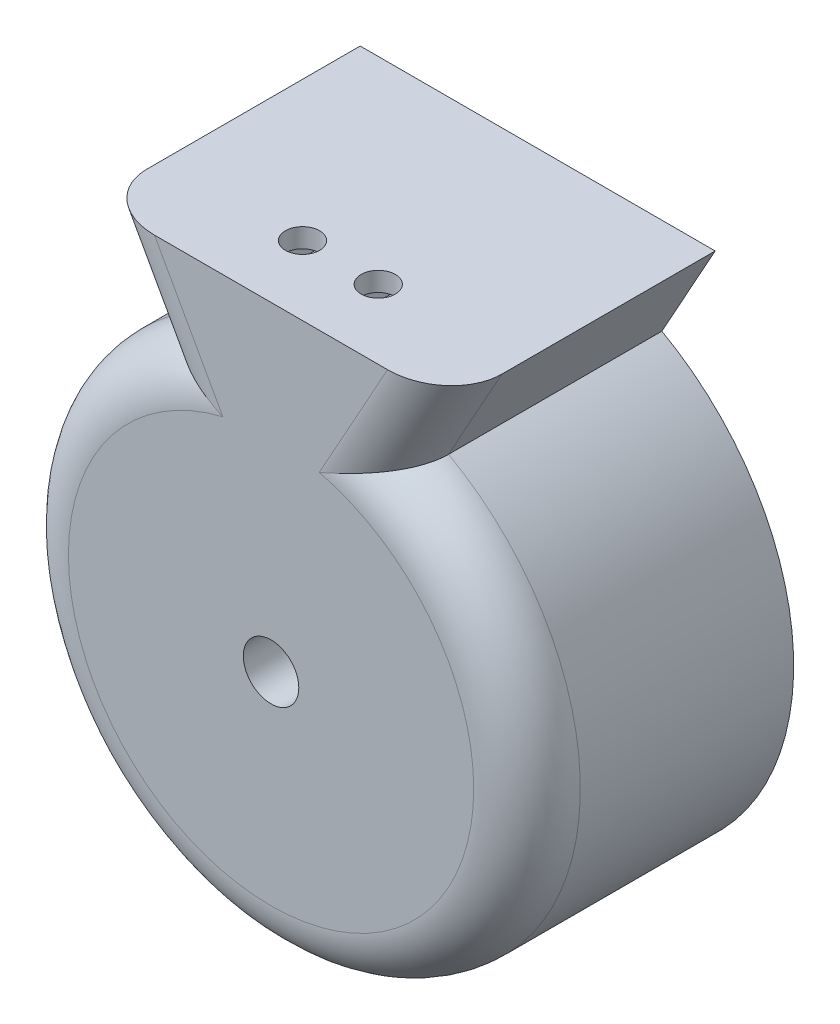
ISO-10303-21;
HEADER;
FILE_DESCRIPTION(('STEP AP214'),'2;1');
FILE_NAME('part.step','',(''),(''),'','','');
FILE_SCHEMA(('AUTOMOTIVE_DESIGN { 1 0 10303 214 1 1 1 1 }'));
ENDSEC;
DATA;
#1=APPLICATION_CONTEXT('core data for automotive mechanical design processes');
#2=APPLICATION_PROTOCOL_DEFINITION('international standard','automotive_design',2000,#1);
#3=PRODUCT_CONTEXT('',#1,'mechanical');
#4=PRODUCT('Part','Part','',(#3));
#5=PRODUCT_RELATED_PRODUCT_CATEGORY('part','',(#4));
#6=PRODUCT_DEFINITION_FORMATION('','',#4);
#7=PRODUCT_DEFINITION_CONTEXT('part definition',#1,'design');
#8=PRODUCT_DEFINITION('design','',#6,#7);
#9=PRODUCT_DEFINITION_SHAPE('','',#8);
#10=(LENGTH_UNIT() NAMED_UNIT(*) SI_UNIT(.MILLI.,.METRE.));
#11=(NAMED_UNIT(*) PLANE_ANGLE_UNIT() SI_UNIT($,.RADIAN.));
#12=(NAMED_UNIT(*) SI_UNIT($,.STERADIAN.) SOLID_ANGLE_UNIT());
#13=UNCERTAINTY_MEASURE_WITH_UNIT(LENGTH_MEASURE(1.E-05),#10,'distance_accuracy_value','');
#14=(GEOMETRIC_REPRESENTATION_CONTEXT(3) GLOBAL_UNCERTAINTY_ASSIGNED_CONTEXT((#13)) GLOBAL_UNIT_ASSIGNED_CONTEXT((#10,
#11,#12)) REPRESENTATION_CONTEXT('',''));
#15=CARTESIAN_POINT('',(0.,0.,0.));
#16=DIRECTION('',(0.,0.,1.));
#17=DIRECTION('',(1.,0.,0.));
#18=AXIS2_PLACEMENT_3D('',#15,#16,#17);
#19=CARTESIAN_POINT('',(0.,0.,0.));
#20=DIRECTION('',(0.,0.,1.));
#21=DIRECTION('',(1.,0.,0.));
#22=AXIS2_PLACEMENT_3D('',#19,#20,#21);
#23=PLANE('',#22);
#24=DIRECTION('',(0.,-1.,0.));
#25=VECTOR('',#24,1.);
#26=CARTESIAN_POINT('',(-6.35,25.8,0.));
#27=LINE('',#26,#25);
#28=CARTESIAN_POINT('',(-6.35,28.2,0.));
#29=VERTEX_POINT('',#28);
#30=CARTESIAN_POINT('',(-6.35,25.8,0.));
#31=VERTEX_POINT('',#30);
#32=EDGE_CURVE('E65',#29,#31,#27,.T.);
#33=ORIENTED_EDGE('',*,*,#32,.T.);
#34=DIRECTION('',(1.,0.,0.));
#35=VECTOR('',#34,1.);
#36=CARTESIAN_POINT('',(-0.749999999999996,25.8,0.));
#37=LINE('',#36,#35);
#38=CARTESIAN_POINT('',(-0.749999999999996,25.8,0.));
#39=VERTEX_POINT('',#38);
#40=EDGE_CURVE('E196',#31,#39,#37,.T.);
#41=ORIENTED_EDGE('',*,*,#40,.T.);
#42=DIRECTION('',(0.,1.,0.));
#43=VECTOR('',#42,1.);
#44=CARTESIAN_POINT('',(-0.749999999999996,25.8,0.));
#45=LINE('',#44,#43);
#46=CARTESIAN_POINT('',(-0.749999999999996,28.2,0.));
#47=VERTEX_POINT('',#46);
#48=EDGE_CURVE('E200',#39,#47,#45,.T.);
#49=ORIENTED_EDGE('',*,*,#48,.T.);
#50=DIRECTION('',(-1.,0.,0.));
#51=VECTOR('',#50,1.);
#52=CARTESIAN_POINT('',(-0.749999999999996,28.2,0.));
#53=LINE('',#52,#51);
#54=EDGE_CURVE('E184',#47,#29,#53,.T.);
#55=ORIENTED_EDGE('',*,*,#54,.T.);
#56=EDGE_LOOP('',(#33,#41,#49,#55));
#57=FACE_BOUND('',#56,.T.);
#58=CARTESIAN_POINT('',(0.,0.,0.));
#59=DIRECTION('',(0.,0.,1.));
#60=DIRECTION('',(1.,0.,0.));
#61=AXIS2_PLACEMENT_3D('',#58,#59,#60);
#62=CIRCLE('',#61,20.);
#63=CARTESIAN_POINT('',(-20.,0.,0.));
#64=VERTEX_POINT('',#63);
#65=EDGE_CURVE('E239',#64,#64,#62,.T.);
#66=ORIENTED_EDGE('',*,*,#65,.T.);
#67=EDGE_LOOP('',(#66));
#68=FACE_BOUND('',#67,.T.);
#69=DIRECTION('',(0.485104998656678,-0.874455910997407,0.));
#70=VECTOR('',#69,1.);
#71=CARTESIAN_POINT('',(-16.6425199677603,30.,0.));
#72=LINE('',#71,#70);
#73=CARTESIAN_POINT('',(-16.6425199677603,30.,0.));
#74=VERTEX_POINT('',#73);
#75=CARTESIAN_POINT('',(-11.6425199677603,20.9869418639378,0.));
#76=VERTEX_POINT('',#75);
#77=EDGE_CURVE('E265',#74,#76,#72,.T.);
#78=ORIENTED_EDGE('',*,*,#77,.F.);
#79=DIRECTION('',(-1.,0.,0.));
#80=VECTOR('',#79,1.);
#81=CARTESIAN_POINT('',(-16.6425199677603,30.,0.));
#82=LINE('',#81,#80);
#83=CARTESIAN_POINT('',(16.6425199677603,30.,0.));
#84=VERTEX_POINT('',#83);
#85=EDGE_CURVE('E264',#84,#74,#82,.T.);
#86=ORIENTED_EDGE('',*,*,#85,.F.);
#87=DIRECTION('',(0.485104998656678,0.874455910997407,0.));
#88=VECTOR('',#87,1.);
#89=CARTESIAN_POINT('',(16.6425199677603,30.,0.));
#90=LINE('',#89,#88);
#91=CARTESIAN_POINT('',(11.6425199677603,20.9869418639378,0.));
#92=VERTEX_POINT('',#91);
#93=EDGE_CURVE('E274',#92,#84,#90,.T.);
#94=ORIENTED_EDGE('',*,*,#93,.F.);
#95=CARTESIAN_POINT('',(0.,0.,0.));
#96=DIRECTION('',(0.,0.,1.));
#97=DIRECTION('',(1.,0.,0.));
#98=AXIS2_PLACEMENT_3D('',#95,#96,#97);
#99=CIRCLE('',#98,24.);
#100=EDGE_CURVE('E269',#76,#92,#99,.T.);
#101=ORIENTED_EDGE('',*,*,#100,.F.);
#102=EDGE_LOOP('',(#78,#86,#94,#101));
#103=FACE_BOUND('',#102,.T.);
#104=DIRECTION('',(0.,-1.,0.));
#105=VECTOR('',#104,1.);
#106=CARTESIAN_POINT('',(0.750000000000003,25.8,0.));
#107=LINE('',#106,#105);
#108=CARTESIAN_POINT('',(0.750000000000003,28.2,0.));
#109=VERTEX_POINT('',#108);
#110=CARTESIAN_POINT('',(0.750000000000003,25.8,0.));
#111=VERTEX_POINT('',#110);
#112=EDGE_CURVE('E57',#109,#111,#107,.T.);
#113=ORIENTED_EDGE('',*,*,#112,.T.);
#114=DIRECTION('',(1.,0.,0.));
#115=VECTOR('',#114,1.);
#116=CARTESIAN_POINT('',(6.35,25.8,0.));
#117=LINE('',#116,#115);
#118=CARTESIAN_POINT('',(6.35,25.8,0.));
#119=VERTEX_POINT('',#118);
#120=EDGE_CURVE('E165',#111,#119,#117,.T.);
#121=ORIENTED_EDGE('',*,*,#120,.T.);
#122=DIRECTION('',(0.,1.,0.));
#123=VECTOR('',#122,1.);
#124=CARTESIAN_POINT('',(6.35,25.8,0.));
#125=LINE('',#124,#123);
#126=CARTESIAN_POINT('',(6.35,28.2,0.));
#127=VERTEX_POINT('',#126);
#128=EDGE_CURVE('E624',#119,#127,#125,.T.);
#129=ORIENTED_EDGE('',*,*,#128,.T.);
#130=DIRECTION('',(-1.,0.,0.));
#131=VECTOR('',#130,1.);
#132=CARTESIAN_POINT('',(6.35,28.2,0.));
#133=LINE('',#132,#131);
#134=EDGE_CURVE('E161',#127,#109,#133,.T.);
#135=ORIENTED_EDGE('',*,*,#134,.T.);
#136=EDGE_LOOP('',(#113,#121,#129,#135));
#137=FACE_BOUND('',#136,.T.);
#138=ADVANCED_FACE('F38',(#57,#68,#103,#137),#23,.F.);
#139=CARTESIAN_POINT('',(3.55,24.,18.5));
#140=DIRECTION('',(0.,1.,0.));
#141=DIRECTION('',(0.,0.,1.));
#142=AXIS2_PLACEMENT_3D('',#139,#140,#141);
#143=CYLINDRICAL_SURFACE('',#142,1.6);
#144=CARTESIAN_POINT('',(3.55,30.,18.5));
#145=DIRECTION('',(0.,-1.,0.));
#146=DIRECTION('',(0.,0.,-1.));
#147=AXIS2_PLACEMENT_3D('',#144,#145,#146);
#148=CIRCLE('',#147,1.6);
#149=CARTESIAN_POINT('',(3.55,30.,16.9));
#150=VERTEX_POINT('',#149);
#151=EDGE_CURVE('E231',#150,#150,#148,.T.);
#152=ORIENTED_EDGE('',*,*,#151,.F.);
#153=EDGE_LOOP('',(#152));
#154=FACE_BOUND('',#153,.T.);
#155=CARTESIAN_POINT('',(3.55,28.2,18.5));
#156=DIRECTION('',(0.,-1.,0.));
#157=DIRECTION('',(0.,0.,-1.));
#158=AXIS2_PLACEMENT_3D('',#155,#156,#157);
#159=CIRCLE('',#158,1.6);
#160=CARTESIAN_POINT('',(3.55,28.2,16.9));
#161=VERTEX_POINT('',#160);
#162=EDGE_CURVE('E608',#161,#161,#159,.T.);
#163=ORIENTED_EDGE('',*,*,#162,.T.);
#164=EDGE_LOOP('',(#163));
#165=FACE_BOUND('',#164,.T.);
#166=ADVANCED_FACE('F343',(#154,#165),#143,.F.);
#167=CARTESIAN_POINT('',(-3.55,24.,18.5));
#168=DIRECTION('',(0.,1.,0.));
#169=DIRECTION('',(0.,0.,1.));
#170=AXIS2_PLACEMENT_3D('',#167,#168,#169);
#171=CYLINDRICAL_SURFACE('',#170,1.6);
#172=CARTESIAN_POINT('',(-3.55,30.,18.5));
#173=DIRECTION('',(0.,-1.,0.));
#174=DIRECTION('',(0.,0.,-1.));
#175=AXIS2_PLACEMENT_3D('',#172,#173,#174);
#176=CIRCLE('',#175,1.6);
#177=CARTESIAN_POINT('',(-3.55,30.,16.9));
#178=VERTEX_POINT('',#177);
#179=EDGE_CURVE('E223',#178,#178,#176,.T.);
#180=ORIENTED_EDGE('',*,*,#179,.F.);
#181=EDGE_LOOP('',(#180));
#182=FACE_BOUND('',#181,.T.);
#183=CARTESIAN_POINT('',(-3.55,28.2,18.5));
#184=DIRECTION('',(0.,-1.,0.));
#185=DIRECTION('',(0.,0.,-1.));
#186=AXIS2_PLACEMENT_3D('',#183,#184,#185);
#187=CIRCLE('',#186,1.6);
#188=CARTESIAN_POINT('',(-3.55,28.2,16.9));
#189=VERTEX_POINT('',#188);
#190=EDGE_CURVE('E167',#189,#189,#187,.T.);
#191=ORIENTED_EDGE('',*,*,#190,.T.);
#192=EDGE_LOOP('',(#191));
#193=FACE_BOUND('',#192,.T.);
#194=ADVANCED_FACE('F352',(#182,#193),#171,.F.);
#195=CARTESIAN_POINT('',(0.,0.,0.));
#196=DIRECTION('',(0.,0.,1.));
#197=DIRECTION('',(1.,0.,0.));
#198=AXIS2_PLACEMENT_3D('',#195,#196,#197);
#199=CIRCLE('',#198,2.6);
#200=CARTESIAN_POINT('',(2.6,0.,0.));
#201=VERTEX_POINT('',#200);
#202=EDGE_CURVE('E247',#201,#201,#199,.T.);
#203=ORIENTED_EDGE('',*,*,#202,.T.);
#204=EDGE_LOOP('',(#203));
#205=FACE_BOUND('',#204,.T.);
#206=CARTESIAN_POINT('',(0.,0.,0.));
#207=DIRECTION('',(0.,0.,1.));
#208=DIRECTION('',(1.,0.,0.));
#209=AXIS2_PLACEMENT_3D('',#206,#207,#208);
#210=CIRCLE('',#209,7.5);
#211=CARTESIAN_POINT('',(-7.5,0.,0.));
#212=VERTEX_POINT('',#211);
#213=EDGE_CURVE('E222',#212,#212,#210,.T.);
#214=ORIENTED_EDGE('',*,*,#213,.F.);
#215=EDGE_LOOP('',(#214));
#216=FACE_BOUND('',#215,.T.);
#217=ADVANCED_FACE('F346',(#205,#216),#23,.F.);
#218=CARTESIAN_POINT('',(-16.6425199677603,30.,25.));
#219=DIRECTION('',(0.874455910997407,0.485104998656678,0.));
#220=DIRECTION('',(-0.485104998656678,0.874455910997407,0.));
#221=AXIS2_PLACEMENT_3D('',#218,#219,#220);
#222=PLANE('',#221);
#223=DIRECTION('',(0.,0.,-1.));
#224=VECTOR('',#223,1.);
#225=CARTESIAN_POINT('',(-11.6425199677603,20.9869418639378,25.));
#226=LINE('',#225,#224);
#227=CARTESIAN_POINT('',(-11.6425199677603,20.9869418639378,20.));
#228=VERTEX_POINT('',#227);
#229=EDGE_CURVE('E289',#228,#76,#226,.T.);
#230=ORIENTED_EDGE('',*,*,#229,.F.);
#231=DIRECTION('',(0.485104998656678,-0.874455910997407,0.));
#232=VECTOR('',#231,1.);
#233=CARTESIAN_POINT('',(-16.6425199677603,30.,20.));
#234=LINE('',#233,#232);
#235=CARTESIAN_POINT('',(-16.6425199677603,30.,20.));
#236=VERTEX_POINT('',#235);
#237=EDGE_CURVE('E305',#228,#236,#234,.F.);
#238=ORIENTED_EDGE('',*,*,#237,.T.);
#239=DIRECTION('',(0.,0.,-1.));
#240=VECTOR('',#239,1.);
#241=CARTESIAN_POINT('',(-16.6425199677603,30.,25.));
#242=LINE('',#241,#240);
#243=EDGE_CURVE('E263',#236,#74,#242,.T.);
#244=ORIENTED_EDGE('',*,*,#243,.T.);
#245=ORIENTED_EDGE('',*,*,#77,.T.);
#246=EDGE_LOOP('',(#230,#238,#244,#245));
#247=FACE_BOUND('',#246,.T.);
#248=ADVANCED_FACE('F360',(#247),#222,.F.);
#249=CARTESIAN_POINT('',(0.,0.,25.));
#250=DIRECTION('',(0.,0.,-1.));
#251=DIRECTION('',(-1.,0.,0.));
#252=AXIS2_PLACEMENT_3D('',#249,#250,#251);
#253=CYLINDRICAL_SURFACE('',#252,24.);
#254=DIRECTION('',(0.,0.,-1.));
#255=VECTOR('',#254,1.);
#256=CARTESIAN_POINT('',(11.6425199677603,20.9869418639378,25.));
#257=LINE('',#256,#255);
#258=CARTESIAN_POINT('',(11.6425199677603,20.9869418639378,20.));
#259=VERTEX_POINT('',#258);
#260=EDGE_CURVE('E286',#259,#92,#257,.T.);
#261=ORIENTED_EDGE('',*,*,#260,.F.);
#262=CARTESIAN_POINT('',(0.,0.,20.));
#263=DIRECTION('',(0.,0.,1.));
#264=DIRECTION('',(1.,0.,0.));
#265=AXIS2_PLACEMENT_3D('',#262,#263,#264);
#266=CIRCLE('',#265,24.);
#267=EDGE_CURVE('E302',#259,#228,#266,.F.);
#268=ORIENTED_EDGE('',*,*,#267,.T.);
#269=ORIENTED_EDGE('',*,*,#229,.T.);
#270=ORIENTED_EDGE('',*,*,#100,.T.);
#271=EDGE_LOOP('',(#261,#268,#269,#270));
#272=FACE_BOUND('',#271,.T.);
#273=ADVANCED_FACE('F365',(#272),#253,.T.);
#274=CARTESIAN_POINT('',(16.6425199677603,30.,25.));
#275=DIRECTION('',(-0.874455910997407,0.485104998656678,0.));
#276=DIRECTION('',(-0.485104998656678,-0.874455910997407,0.));
#277=AXIS2_PLACEMENT_3D('',#274,#275,#276);
#278=PLANE('',#277);
#279=DIRECTION('',(0.,0.,-1.));
#280=VECTOR('',#279,1.);
#281=CARTESIAN_POINT('',(16.6425199677603,30.,25.));
#282=LINE('',#281,#280);
#283=CARTESIAN_POINT('',(16.6425199677603,30.,20.));
#284=VERTEX_POINT('',#283);
#285=EDGE_CURVE('E283',#284,#84,#282,.T.);
#286=ORIENTED_EDGE('',*,*,#285,.F.);
#287=DIRECTION('',(0.485104998656678,0.874455910997407,0.));
#288=VECTOR('',#287,1.);
#289=CARTESIAN_POINT('',(11.6425199677603,20.9869418639378,20.));
#290=LINE('',#289,#288);
#291=EDGE_CURVE('E11',#284,#259,#290,.F.);
#292=ORIENTED_EDGE('',*,*,#291,.T.);
#293=ORIENTED_EDGE('',*,*,#260,.T.);
#294=ORIENTED_EDGE('',*,*,#93,.T.);
#295=EDGE_LOOP('',(#286,#292,#293,#294));
#296=FACE_BOUND('',#295,.T.);
#297=ADVANCED_FACE('F404',(#296),#278,.F.);
#298=CARTESIAN_POINT('',(-16.6425199677603,30.,25.));
#299=DIRECTION('',(0.,-1.,0.));
#300=DIRECTION('',(0.,0.,-1.));
#301=AXIS2_PLACEMENT_3D('',#298,#299,#300);
#302=PLANE('',#301);
#303=ORIENTED_EDGE('',*,*,#179,.T.);
#304=EDGE_LOOP('',(#303));
#305=FACE_BOUND('',#304,.T.);
#306=ORIENTED_EDGE('',*,*,#151,.T.);
#307=EDGE_LOOP('',(#306));
#308=FACE_BOUND('',#307,.T.);
#309=ORIENTED_EDGE('',*,*,#243,.F.);
#310=CARTESIAN_POINT('',(-10.9246788083392,30.,20.));
#311=DIRECTION('',(0.,-1.,0.));
#312=DIRECTION('',(-1.,0.,0.));
#313=AXIS2_PLACEMENT_3D('',#310,#311,#312);
#314=ELLIPSE('',#313,5.71784115942105,5.);
#315=CARTESIAN_POINT('',(-10.9246788083392,30.,25.));
#316=VERTEX_POINT('',#315);
#317=EDGE_CURVE('E49',#236,#316,#314,.F.);
#318=ORIENTED_EDGE('',*,*,#317,.T.);
#319=DIRECTION('',(-1.,0.,0.));
#320=VECTOR('',#319,1.);
#321=CARTESIAN_POINT('',(-16.6425199677603,30.,25.));
#322=LINE('',#321,#320);
#323=CARTESIAN_POINT('',(10.9246788083392,30.,25.));
#324=VERTEX_POINT('',#323);
#325=EDGE_CURVE('E259',#324,#316,#322,.T.);
#326=ORIENTED_EDGE('',*,*,#325,.F.);
#327=CARTESIAN_POINT('',(10.9246788083392,30.,20.));
#328=DIRECTION('',(0.,-1.,0.));
#329=DIRECTION('',(-1.,0.,0.));
#330=AXIS2_PLACEMENT_3D('',#327,#328,#329);
#331=ELLIPSE('',#330,5.71784115942105,5.);
#332=EDGE_CURVE('E308',#324,#284,#331,.F.);
#333=ORIENTED_EDGE('',*,*,#332,.T.);
#334=ORIENTED_EDGE('',*,*,#285,.T.);
#335=ORIENTED_EDGE('',*,*,#85,.T.);
#336=EDGE_LOOP('',(#309,#318,#326,#333,#334,#335));
#337=FACE_BOUND('',#336,.T.);
#338=ADVANCED_FACE('F396',(#305,#308,#337),#302,.F.);
#339=CARTESIAN_POINT('',(0.,0.,25.));
#340=DIRECTION('',(0.,0.,1.));
#341=DIRECTION('',(1.,0.,0.));
#342=AXIS2_PLACEMENT_3D('',#339,#340,#341);
#343=PLANE('',#342);
#344=CARTESIAN_POINT('',(0.,0.,25.));
#345=DIRECTION('',(0.,0.,1.));
#346=DIRECTION('',(1.,0.,0.));
#347=AXIS2_PLACEMENT_3D('',#344,#345,#346);
#348=CIRCLE('',#347,2.6);
#349=CARTESIAN_POINT('',(2.6,0.,25.));
#350=VERTEX_POINT('',#349);
#351=EDGE_CURVE('E254',#350,#350,#348,.F.);
#352=ORIENTED_EDGE('',*,*,#351,.T.);
#353=EDGE_LOOP('',(#352));
#354=FACE_BOUND('',#353,.T.);
#355=ORIENTED_EDGE('',*,*,#325,.T.);
#356=DIRECTION('',(0.485104998656678,-0.874455910997407,0.));
#357=VECTOR('',#356,1.);
#358=CARTESIAN_POINT('',(-7.27024041277324,23.4124668572212,25.));
#359=LINE('',#358,#357);
#360=CARTESIAN_POINT('',(-4.51984195039568,18.4545666094721,25.));
#361=VERTEX_POINT('',#360);
#362=EDGE_CURVE('E299',#316,#361,#359,.T.);
#363=ORIENTED_EDGE('',*,*,#362,.T.);
#364=CARTESIAN_POINT('',(0.,0.,25.));
#365=DIRECTION('',(0.,0.,1.));
#366=DIRECTION('',(1.,0.,0.));
#367=AXIS2_PLACEMENT_3D('',#364,#365,#366);
#368=CIRCLE('',#367,19.);
#369=CARTESIAN_POINT('',(4.51984195039569,18.4545666094721,25.));
#370=VERTEX_POINT('',#369);
#371=EDGE_CURVE('E295',#361,#370,#368,.T.);
#372=ORIENTED_EDGE('',*,*,#371,.T.);
#373=DIRECTION('',(0.485104998656678,0.874455910997407,0.));
#374=VECTOR('',#373,1.);
#375=CARTESIAN_POINT('',(12.2702404127732,32.4255249932834,25.));
#376=LINE('',#375,#374);
#377=EDGE_CURVE('E292',#370,#324,#376,.T.);
#378=ORIENTED_EDGE('',*,*,#377,.T.);
#379=EDGE_LOOP('',(#355,#363,#372,#378));
#380=FACE_BOUND('',#379,.T.);
#381=ADVANCED_FACE('F394',(#354,#380),#343,.T.);
#382=CARTESIAN_POINT('',(4.37227955498703,2.42552499328339,20.));
#383=DIRECTION('',(-0.485104998656678,0.874455910997407,0.));
#384=DIRECTION('',(-0.874455910997407,-0.485104998656678,0.));
#385=AXIS2_PLACEMENT_3D('',#382,#383,#384);
#386=CYLINDRICAL_SURFACE('',#385,5.);
#387=ORIENTED_EDGE('',*,*,#317,.F.);
#388=ORIENTED_EDGE('',*,*,#237,.F.);
#389=CARTESIAN_POINT('',(-11.6425199677603,20.9869418639378,20.));
#390=CARTESIAN_POINT('',(-11.6425563637024,20.986949702309,20.1110809305904));
#391=CARTESIAN_POINT('',(-11.6374889378853,20.9855010174335,20.2221451743304));
#392=CARTESIAN_POINT('',(-11.6174202559301,20.9797501078385,20.4432229670775));
#393=CARTESIAN_POINT('',(-11.6024259043949,20.9754498664957,20.5532371925033));
#394=CARTESIAN_POINT('',(-11.5629333487422,20.9641002796661,20.7704916901836));
#395=CARTESIAN_POINT('',(-11.5385112811402,20.9570729552661,20.8777470234529));
#396=CARTESIAN_POINT('',(-11.4806367980543,20.9403708692588,21.089584647432));
#397=CARTESIAN_POINT('',(-11.4471832822611,20.9306957850707,21.1941666107421));
#398=CARTESIAN_POINT('',(-11.3719386642351,20.9088544298474,21.3996792928997));
#399=CARTESIAN_POINT('',(-11.3301710174596,20.8966951645859,21.5006193605906));
#400=CARTESIAN_POINT('',(-11.2389115205385,20.8700128848085,21.6986304462172));
#401=CARTESIAN_POINT('',(-11.1894166651744,20.8554889505455,21.795699940316));
#402=CARTESIAN_POINT('',(-11.0302091801899,20.8085383771394,22.0807526956545));
#403=CARTESIAN_POINT('',(-10.9098532942409,20.7727558679783,22.2623682844986));
#404=CARTESIAN_POINT('',(-10.687497937593,20.7058079959969,22.5529884148896));
#405=CARTESIAN_POINT('',(-10.5913404095873,20.6766394721522,22.6670730902747));
#406=CARTESIAN_POINT('',(-10.3899541981053,20.6149848273659,22.8860128548247));
#407=CARTESIAN_POINT('',(-10.2847225037476,20.5824976045879,22.9908648570091));
#408=CARTESIAN_POINT('',(-9.95746974493845,20.48045356151,23.2917621786887));
#409=CARTESIAN_POINT('',(-9.72401025908104,20.4063498933554,23.4739979856695));
#410=CARTESIAN_POINT('',(-9.30773916507586,20.2711947180552,23.7553155077158));
#411=CARTESIAN_POINT('',(-9.12985816011624,20.2125847453134,23.8631899845422));
#412=CARTESIAN_POINT('',(-8.76645103284788,20.0908567857218,24.0622614929132));
#413=CARTESIAN_POINT('',(-8.5809248874987,20.0277387852855,24.1534584741917));
#414=CARTESIAN_POINT('',(-8.20411706377211,19.8973396353012,24.320307324793));
#415=CARTESIAN_POINT('',(-8.01282693082726,19.8300522004281,24.3959349435773));
#416=CARTESIAN_POINT('',(-7.62645990975698,19.6917460739154,24.5325129848716));
#417=CARTESIAN_POINT('',(-7.43138343219087,19.6207277854087,24.5934649891802));
#418=CARTESIAN_POINT('',(-7.01230751540107,19.4654140615453,24.7089673622161));
#419=CARTESIAN_POINT('',(-6.78795106534931,19.3806186147475,24.7615500655049));
#420=CARTESIAN_POINT('',(-6.33765741696697,19.206891074661,24.8503788031083));
#421=CARTESIAN_POINT('',(-6.11171990077652,19.1179581280075,24.8866214506378));
#422=CARTESIAN_POINT('',(-5.4341490328795,18.8456169787225,24.9724733622253));
#423=CARTESIAN_POINT('',(-4.98173959887534,18.6562913399684,24.9994730841093));
#424=CARTESIAN_POINT('',(-4.52863749807689,18.4584102266407,24.999997449427));
#425=CARTESIAN_POINT('',(-4.52423954397619,18.456488736201,24.9999999951428));
#426=CARTESIAN_POINT('',(-4.51984195039568,18.4545666094721,25.));
#427=B_SPLINE_CURVE_WITH_KNOTS('',3,(#389,#390,#391,#392,#393,#394,#395,#396,#397,#398,#399,
#400,#401,#402,#403,#404,#405,#406,#407,#408,#409,#410,#411,#412,#413,#414,#415,#416,#417,#418,
#419,#420,#421,#422,#423,#424,#425,#426),.UNSPECIFIED.,.F.,.F.,(4,2,2,2,2,2,2,2,2,2,2,2,2,2,2,2,
2,2,4),(0.,0.333091522337572,0.665951608280876,0.996177989342319,1.32644462034871,
1.65579239621511,1.98526858054935,2.64489613947256,3.10043556645456,3.55612673102623,
4.46808836324442,5.1157474944093,5.76340857759079,6.41207093760641,7.06066335077733,
7.79660543005898,8.53269997718596,10.0015617631778,10.0159599248244),.UNSPECIFIED.);
#428=EDGE_CURVE('E270',#361,#228,#427,.F.);
#429=ORIENTED_EDGE('',*,*,#428,.F.);
#430=ORIENTED_EDGE('',*,*,#362,.F.);
#431=EDGE_LOOP('',(#387,#388,#429,#430));
#432=FACE_BOUND('',#431,.T.);
#433=ADVANCED_FACE('F40',(#432),#386,.T.);
#434=CARTESIAN_POINT('',(-4.37227955498702,2.42552499328338,20.));
#435=DIRECTION('',(-0.485104998656678,-0.874455910997407,0.));
#436=DIRECTION('',(0.874455910997407,-0.485104998656678,0.));
#437=AXIS2_PLACEMENT_3D('',#434,#435,#436);
#438=CYLINDRICAL_SURFACE('',#437,5.);
#439=ORIENTED_EDGE('',*,*,#332,.F.);
#440=ORIENTED_EDGE('',*,*,#377,.F.);
#441=CARTESIAN_POINT('',(11.6425199677603,20.9869418639378,20.));
#442=CARTESIAN_POINT('',(11.6425563637024,20.986949702309,20.1110809305904));
#443=CARTESIAN_POINT('',(11.6374889378853,20.9855010174335,20.2221451743304));
#444=CARTESIAN_POINT('',(11.6174202559301,20.9797501078385,20.4432229670775));
#445=CARTESIAN_POINT('',(11.6024259043949,20.9754498664957,20.5532371925033));
#446=CARTESIAN_POINT('',(11.5629333487422,20.9641002796661,20.7704916901836));
#447=CARTESIAN_POINT('',(11.5385112811402,20.9570729552661,20.8777470234529));
#448=CARTESIAN_POINT('',(11.4806367980543,20.9403708692588,21.089584647432));
#449=CARTESIAN_POINT('',(11.4471832822611,20.9306957850707,21.1941666107421));
#450=CARTESIAN_POINT('',(11.3719386642351,20.9088544298474,21.3996792928997));
#451=CARTESIAN_POINT('',(11.3301710174596,20.8966951645859,21.5006193605906));
#452=CARTESIAN_POINT('',(11.2389115205385,20.8700128848085,21.6986304462172));
#453=CARTESIAN_POINT('',(11.1894166651744,20.8554889505455,21.795699940316));
#454=CARTESIAN_POINT('',(11.0302091801899,20.8085383771394,22.0807526956545));
#455=CARTESIAN_POINT('',(10.909853294241,20.7727558679783,22.2623682844986));
#456=CARTESIAN_POINT('',(10.687497937593,20.7058079959969,22.5529884148896));
#457=CARTESIAN_POINT('',(10.5913404095873,20.6766394721522,22.6670730902747));
#458=CARTESIAN_POINT('',(10.3899541981053,20.6149848273659,22.8860128548247));
#459=CARTESIAN_POINT('',(10.2847225037476,20.5824976045879,22.9908648570091));
#460=CARTESIAN_POINT('',(9.95746974493844,20.48045356151,23.2917621786887));
#461=CARTESIAN_POINT('',(9.72401025908104,20.4063498933554,23.4739979856695));
#462=CARTESIAN_POINT('',(9.30773916507586,20.2711947180552,23.7553155077158));
#463=CARTESIAN_POINT('',(9.12985816011624,20.2125847453134,23.8631899845422));
#464=CARTESIAN_POINT('',(8.76645103284788,20.0908567857218,24.0622614929132));
#465=CARTESIAN_POINT('',(8.58092488749869,20.0277387852855,24.1534584741917));
#466=CARTESIAN_POINT('',(8.20411706377211,19.8973396353012,24.320307324793));
#467=CARTESIAN_POINT('',(8.01282693082726,19.830052200428,24.3959349435773));
#468=CARTESIAN_POINT('',(7.62645990975697,19.6917460739154,24.5325129848716));
#469=CARTESIAN_POINT('',(7.43138343219087,19.6207277854087,24.5934649891802));
#470=CARTESIAN_POINT('',(7.01230751540107,19.4654140615453,24.7089673622161));
#471=CARTESIAN_POINT('',(6.78795106534931,19.3806186147475,24.7615500655049));
#472=CARTESIAN_POINT('',(6.33765741696698,19.206891074661,24.8503788031083));
#473=CARTESIAN_POINT('',(6.11171990077652,19.1179581280075,24.8866214506378));
#474=CARTESIAN_POINT('',(5.43414903287953,18.8456169787225,24.9724733622253));
#475=CARTESIAN_POINT('',(4.98173959887544,18.6562913399681,24.9994730841093));
#476=CARTESIAN_POINT('',(4.5286374980769,18.4584102266407,24.999997449427));
#477=CARTESIAN_POINT('',(4.5242395439762,18.456488736201,24.9999999951428));
#478=CARTESIAN_POINT('',(4.51984195039569,18.4545666094721,25.));
#479=B_SPLINE_CURVE_WITH_KNOTS('',3,(#441,#442,#443,#444,#445,#446,#447,#448,#449,#450,#451,
#452,#453,#454,#455,#456,#457,#458,#459,#460,#461,#462,#463,#464,#465,#466,#467,#468,#469,#470,
#471,#472,#473,#474,#475,#476,#477,#478),.UNSPECIFIED.,.F.,.F.,(4,2,2,2,2,2,2,2,2,2,2,2,2,2,2,2,
2,2,4),(0.,0.333091522337572,0.665951608280876,0.996177989342319,1.32644462034871,
1.65579239621512,1.98526858054936,2.64489613947256,3.10043556645456,3.55612673102623,
4.46808836324442,5.11574749440931,5.7634085775908,6.41207093760642,7.06066335077734,
7.79660543005899,8.53269997718595,10.0015617631778,10.0159599248244),.UNSPECIFIED.);
#480=EDGE_CURVE('E258',#259,#370,#479,.T.);
#481=ORIENTED_EDGE('',*,*,#480,.F.);
#482=ORIENTED_EDGE('',*,*,#291,.F.);
#483=EDGE_LOOP('',(#439,#440,#481,#482));
#484=FACE_BOUND('',#483,.T.);
#485=ADVANCED_FACE('F324',(#484),#438,.T.);
#486=CARTESIAN_POINT('',(0.,0.,20.));
#487=DIRECTION('',(0.,0.,1.));
#488=DIRECTION('',(1.,0.,0.));
#489=AXIS2_PLACEMENT_3D('',#486,#487,#488);
#490=TOROIDAL_SURFACE('',#489,19.,5.);
#491=ORIENTED_EDGE('',*,*,#428,.T.);
#492=ORIENTED_EDGE('',*,*,#267,.F.);
#493=ORIENTED_EDGE('',*,*,#480,.T.);
#494=ORIENTED_EDGE('',*,*,#371,.F.);
#495=EDGE_LOOP('',(#491,#492,#493,#494));
#496=FACE_BOUND('',#495,.T.);
#497=ADVANCED_FACE('F327',(#496),#490,.T.);
#498=CARTESIAN_POINT('',(0.,0.,25.438653710377));
#499=DIRECTION('',(0.,0.,-1.));
#500=DIRECTION('',(-1.,0.,0.));
#501=AXIS2_PLACEMENT_3D('',#498,#499,#500);
#502=CYLINDRICAL_SURFACE('',#501,2.6);
#503=ORIENTED_EDGE('',*,*,#351,.F.);
#504=EDGE_LOOP('',(#503));
#505=FACE_BOUND('',#504,.T.);
#506=ORIENTED_EDGE('',*,*,#202,.F.);
#507=EDGE_LOOP('',(#506));
#508=FACE_BOUND('',#507,.T.);
#509=ADVANCED_FACE('F330',(#505,#508),#502,.F.);
#510=CARTESIAN_POINT('',(0.,0.,21.));
#511=DIRECTION('',(0.,0.,1.));
#512=DIRECTION('',(1.,0.,0.));
#513=AXIS2_PLACEMENT_3D('',#510,#511,#512);
#514=PLANE('',#513);
#515=CARTESIAN_POINT('',(0.,0.,21.));
#516=DIRECTION('',(0.,0.,1.));
#517=DIRECTION('',(1.,0.,0.));
#518=AXIS2_PLACEMENT_3D('',#515,#516,#517);
#519=CIRCLE('',#518,20.);
#520=CARTESIAN_POINT('',(-20.,0.,21.));
#521=VERTEX_POINT('',#520);
#522=EDGE_CURVE('E243',#521,#521,#519,.T.);
#523=ORIENTED_EDGE('',*,*,#522,.F.);
#524=EDGE_LOOP('',(#523));
#525=FACE_BOUND('',#524,.T.);
#526=CARTESIAN_POINT('',(0.,0.,21.));
#527=DIRECTION('',(0.,0.,1.));
#528=DIRECTION('',(1.,0.,0.));
#529=AXIS2_PLACEMENT_3D('',#526,#527,#528);
#530=CIRCLE('',#529,7.5);
#531=CARTESIAN_POINT('',(-7.5,0.,21.));
#532=VERTEX_POINT('',#531);
#533=EDGE_CURVE('E235',#532,#532,#530,.T.);
#534=ORIENTED_EDGE('',*,*,#533,.T.);
#535=EDGE_LOOP('',(#534));
#536=FACE_BOUND('',#535,.T.);
#537=ADVANCED_FACE('F337',(#525,#536),#514,.F.);
#538=CARTESIAN_POINT('',(0.,0.,21.));
#539=DIRECTION('',(0.,0.,-1.));
#540=DIRECTION('',(-1.,0.,0.));
#541=AXIS2_PLACEMENT_3D('',#538,#539,#540);
#542=CYLINDRICAL_SURFACE('',#541,20.);
#543=CARTESIAN_POINT('',(-20.,0.,21.));
#544=CARTESIAN_POINT('',(-20.,0.,20.78125));
#545=CARTESIAN_POINT('',(-20.,0.,20.5625));
#546=CARTESIAN_POINT('',(-20.,0.,20.125));
#547=CARTESIAN_POINT('',(-20.,0.,19.90625));
#548=CARTESIAN_POINT('',(-20.,0.,19.46875));
#549=CARTESIAN_POINT('',(-20.,0.,19.25));
#550=CARTESIAN_POINT('',(-20.,0.,18.8125));
#551=CARTESIAN_POINT('',(-20.,0.,18.59375));
#552=CARTESIAN_POINT('',(-20.,0.,18.15625));
#553=CARTESIAN_POINT('',(-20.,0.,17.9375));
#554=CARTESIAN_POINT('',(-20.,0.,17.5));
#555=CARTESIAN_POINT('',(-20.,0.,17.28125));
#556=CARTESIAN_POINT('',(-20.,0.,16.84375));
#557=CARTESIAN_POINT('',(-20.,0.,16.625));
#558=CARTESIAN_POINT('',(-20.,0.,16.1875));
#559=CARTESIAN_POINT('',(-20.,0.,15.96875));
#560=CARTESIAN_POINT('',(-20.,0.,15.53125));
#561=CARTESIAN_POINT('',(-20.,0.,15.3125));
#562=CARTESIAN_POINT('',(-20.,0.,14.875));
#563=CARTESIAN_POINT('',(-20.,0.,14.65625));
#564=CARTESIAN_POINT('',(-20.,0.,14.21875));
#565=CARTESIAN_POINT('',(-20.,0.,14.));
#566=CARTESIAN_POINT('',(-20.,0.,13.5625));
#567=CARTESIAN_POINT('',(-20.,0.,13.34375));
#568=CARTESIAN_POINT('',(-20.,0.,12.90625));
#569=CARTESIAN_POINT('',(-20.,0.,12.6875));
#570=CARTESIAN_POINT('',(-20.,0.,12.25));
#571=CARTESIAN_POINT('',(-20.,0.,12.03125));
#572=CARTESIAN_POINT('',(-20.,0.,11.59375));
#573=CARTESIAN_POINT('',(-20.,0.,11.375));
#574=CARTESIAN_POINT('',(-20.,0.,10.9375));
#575=CARTESIAN_POINT('',(-20.,0.,10.71875));
#576=CARTESIAN_POINT('',(-20.,0.,10.28125));
#577=CARTESIAN_POINT('',(-20.,0.,10.0625));
#578=CARTESIAN_POINT('',(-20.,0.,9.625));
#579=CARTESIAN_POINT('',(-20.,0.,9.40625));
#580=CARTESIAN_POINT('',(-20.,0.,8.96875));
#581=CARTESIAN_POINT('',(-20.,0.,8.75));
#582=CARTESIAN_POINT('',(-20.,0.,8.3125));
#583=CARTESIAN_POINT('',(-20.,0.,8.09375));
#584=CARTESIAN_POINT('',(-20.,0.,7.65625));
#585=CARTESIAN_POINT('',(-20.,0.,7.4375));
#586=CARTESIAN_POINT('',(-20.,0.,7.));
#587=CARTESIAN_POINT('',(-20.,0.,6.78125));
#588=CARTESIAN_POINT('',(-20.,0.,6.34375));
#589=CARTESIAN_POINT('',(-20.,0.,6.125));
#590=CARTESIAN_POINT('',(-20.,0.,5.6875));
#591=CARTESIAN_POINT('',(-20.,0.,5.46875));
#592=CARTESIAN_POINT('',(-20.,0.,5.03125));
#593=CARTESIAN_POINT('',(-20.,0.,4.8125));
#594=CARTESIAN_POINT('',(-20.,0.,4.375));
#595=CARTESIAN_POINT('',(-20.,0.,4.15625));
#596=CARTESIAN_POINT('',(-20.,0.,3.71875));
#597=CARTESIAN_POINT('',(-20.,0.,3.5));
#598=CARTESIAN_POINT('',(-20.,0.,3.0625));
#599=CARTESIAN_POINT('',(-20.,0.,2.84375));
#600=CARTESIAN_POINT('',(-20.,0.,2.40625));
#601=CARTESIAN_POINT('',(-20.,0.,2.1875));
#602=CARTESIAN_POINT('',(-20.,0.,1.75));
#603=CARTESIAN_POINT('',(-20.,0.,1.53125));
#604=CARTESIAN_POINT('',(-20.,0.,1.09375));
#605=CARTESIAN_POINT('',(-20.,0.,0.875000000000001));
#606=CARTESIAN_POINT('',(-20.,0.,0.4375));
#607=CARTESIAN_POINT('',(-20.,0.,0.21875));
#608=CARTESIAN_POINT('',(-20.,0.,0.));
#609=B_SPLINE_CURVE_WITH_KNOTS('',3,(#543,#544,#545,#546,#547,#548,#549,#550,#551,#552,#553,
#554,#555,#556,#557,#558,#559,#560,#561,#562,#563,#564,#565,#566,#567,#568,#569,#570,#571,#572,
#573,#574,#575,#576,#577,#578,#579,#580,#581,#582,#583,#584,#585,#586,#587,#588,#589,#590,#591,
#592,#593,#594,#595,#596,#597,#598,#599,#600,#601,#602,#603,#604,#605,#606,#607,#608),
.UNSPECIFIED.,.F.,.F.,(4,2,2,2,2,2,2,2,2,2,2,2,2,2,2,2,2,2,2,2,2,2,2,2,2,2,2,2,2,2,2,2,4),(0.,
0.656250000000001,1.3125,1.96875,2.625,3.28125,3.9375,4.59375,5.25,5.90625,6.5625,7.21875,7.875,
8.53125,9.1875,9.84375,10.5,11.15625,11.8125,12.46875,13.125,13.78125,14.4375,15.09375,15.75,
16.40625,17.0625,17.71875,18.375,19.03125,19.6875,20.34375,21.),.UNSPECIFIED.);
#610=EDGE_CURVE('BSEAM378',#521,#64,#609,.T.);
#611=ORIENTED_EDGE('',*,*,#522,.T.);
#612=ORIENTED_EDGE('',*,*,#65,.F.);
#613=ORIENTED_EDGE('',*,*,#610,.T.);
#614=ORIENTED_EDGE('',*,*,#610,.F.);
#615=EDGE_LOOP('',(#611,#613,#612,#614));
#616=FACE_BOUND('',#615,.T.);
#617=ADVANCED_FACE('F378',(#616),#542,.F.);
#618=CARTESIAN_POINT('',(0.,0.,21.));
#619=DIRECTION('',(0.,0.,-1.));
#620=DIRECTION('',(-1.,0.,0.));
#621=AXIS2_PLACEMENT_3D('',#618,#619,#620);
#622=CYLINDRICAL_SURFACE('',#621,7.5);
#623=CARTESIAN_POINT('',(-7.5,0.,21.));
#624=CARTESIAN_POINT('',(-7.5,0.,20.78125));
#625=CARTESIAN_POINT('',(-7.5,0.,20.5625));
#626=CARTESIAN_POINT('',(-7.5,0.,20.125));
#627=CARTESIAN_POINT('',(-7.5,0.,19.90625));
#628=CARTESIAN_POINT('',(-7.5,0.,19.46875));
#629=CARTESIAN_POINT('',(-7.5,0.,19.25));
#630=CARTESIAN_POINT('',(-7.5,0.,18.8125));
#631=CARTESIAN_POINT('',(-7.5,0.,18.59375));
#632=CARTESIAN_POINT('',(-7.5,0.,18.15625));
#633=CARTESIAN_POINT('',(-7.5,0.,17.9375));
#634=CARTESIAN_POINT('',(-7.5,0.,17.5));
#635=CARTESIAN_POINT('',(-7.5,0.,17.28125));
#636=CARTESIAN_POINT('',(-7.5,0.,16.84375));
#637=CARTESIAN_POINT('',(-7.5,0.,16.625));
#638=CARTESIAN_POINT('',(-7.5,0.,16.1875));
#639=CARTESIAN_POINT('',(-7.5,0.,15.96875));
#640=CARTESIAN_POINT('',(-7.5,0.,15.53125));
#641=CARTESIAN_POINT('',(-7.5,0.,15.3125));
#642=CARTESIAN_POINT('',(-7.5,0.,14.875));
#643=CARTESIAN_POINT('',(-7.5,0.,14.65625));
#644=CARTESIAN_POINT('',(-7.5,0.,14.21875));
#645=CARTESIAN_POINT('',(-7.5,0.,14.));
#646=CARTESIAN_POINT('',(-7.5,0.,13.5625));
#647=CARTESIAN_POINT('',(-7.5,0.,13.34375));
#648=CARTESIAN_POINT('',(-7.5,0.,12.90625));
#649=CARTESIAN_POINT('',(-7.5,0.,12.6875));
#650=CARTESIAN_POINT('',(-7.5,0.,12.25));
#651=CARTESIAN_POINT('',(-7.5,0.,12.03125));
#652=CARTESIAN_POINT('',(-7.5,0.,11.59375));
#653=CARTESIAN_POINT('',(-7.5,0.,11.375));
#654=CARTESIAN_POINT('',(-7.5,0.,10.9375));
#655=CARTESIAN_POINT('',(-7.5,0.,10.71875));
#656=CARTESIAN_POINT('',(-7.5,0.,10.28125));
#657=CARTESIAN_POINT('',(-7.5,0.,10.0625));
#658=CARTESIAN_POINT('',(-7.5,0.,9.625));
#659=CARTESIAN_POINT('',(-7.5,0.,9.40625));
#660=CARTESIAN_POINT('',(-7.5,0.,8.96875));
#661=CARTESIAN_POINT('',(-7.5,0.,8.75));
#662=CARTESIAN_POINT('',(-7.5,0.,8.3125));
#663=CARTESIAN_POINT('',(-7.5,0.,8.09375));
#664=CARTESIAN_POINT('',(-7.5,0.,7.65625));
#665=CARTESIAN_POINT('',(-7.5,0.,7.4375));
#666=CARTESIAN_POINT('',(-7.5,0.,7.));
#667=CARTESIAN_POINT('',(-7.5,0.,6.78125));
#668=CARTESIAN_POINT('',(-7.5,0.,6.34375));
#669=CARTESIAN_POINT('',(-7.5,0.,6.125));
#670=CARTESIAN_POINT('',(-7.5,0.,5.6875));
#671=CARTESIAN_POINT('',(-7.5,0.,5.46875));
#672=CARTESIAN_POINT('',(-7.5,0.,5.03125));
#673=CARTESIAN_POINT('',(-7.5,0.,4.8125));
#674=CARTESIAN_POINT('',(-7.5,0.,4.375));
#675=CARTESIAN_POINT('',(-7.5,0.,4.15625));
#676=CARTESIAN_POINT('',(-7.5,0.,3.71875));
#677=CARTESIAN_POINT('',(-7.5,0.,3.5));
#678=CARTESIAN_POINT('',(-7.5,0.,3.0625));
#679=CARTESIAN_POINT('',(-7.5,0.,2.84375));
#680=CARTESIAN_POINT('',(-7.5,0.,2.40625));
#681=CARTESIAN_POINT('',(-7.5,0.,2.1875));
#682=CARTESIAN_POINT('',(-7.5,0.,1.75));
#683=CARTESIAN_POINT('',(-7.5,0.,1.53125));
#684=CARTESIAN_POINT('',(-7.5,0.,1.09375));
#685=CARTESIAN_POINT('',(-7.5,0.,0.875000000000001));
#686=CARTESIAN_POINT('',(-7.5,0.,0.4375));
#687=CARTESIAN_POINT('',(-7.5,0.,0.21875));
#688=CARTESIAN_POINT('',(-7.5,0.,0.));
#689=B_SPLINE_CURVE_WITH_KNOTS('',3,(#623,#624,#625,#626,#627,#628,#629,#630,#631,#632,#633,
#634,#635,#636,#637,#638,#639,#640,#641,#642,#643,#644,#645,#646,#647,#648,#649,#650,#651,#652,
#653,#654,#655,#656,#657,#658,#659,#660,#661,#662,#663,#664,#665,#666,#667,#668,#669,#670,#671,
#672,#673,#674,#675,#676,#677,#678,#679,#680,#681,#682,#683,#684,#685,#686,#687,#688),
.UNSPECIFIED.,.F.,.F.,(4,2,2,2,2,2,2,2,2,2,2,2,2,2,2,2,2,2,2,2,2,2,2,2,2,2,2,2,2,2,2,2,4),(0.,
0.656249999999997,1.3125,1.96875,2.625,3.28125,3.9375,4.59375,5.25,5.90625,6.5625,7.21875,7.875,
8.53125,9.1875,9.84375,10.5,11.15625,11.8125,12.46875,13.125,13.78125,14.4375,15.09375,15.75,
16.40625,17.0625,17.71875,18.375,19.03125,19.6875,20.34375,21.),.UNSPECIFIED.);
#690=EDGE_CURVE('BSEAM375',#532,#212,#689,.T.);
#691=ORIENTED_EDGE('',*,*,#533,.F.);
#692=ORIENTED_EDGE('',*,*,#213,.T.);
#693=ORIENTED_EDGE('',*,*,#690,.T.);
#694=ORIENTED_EDGE('',*,*,#690,.F.);
#695=EDGE_LOOP('',(#691,#693,#692,#694));
#696=FACE_BOUND('',#695,.T.);
#697=ADVANCED_FACE('F375',(#696),#622,.T.);
#698=CARTESIAN_POINT('',(-6.35,25.8,22.5));
#699=DIRECTION('',(1.,0.,0.));
#700=DIRECTION('',(0.,0.,-1.));
#701=AXIS2_PLACEMENT_3D('',#698,#699,#700);
#702=PLANE('',#701);
#703=ORIENTED_EDGE('',*,*,#32,.F.);
#704=DIRECTION('',(0.,0.,-1.));
#705=VECTOR('',#704,1.);
#706=CARTESIAN_POINT('',(-6.35,28.2,22.5));
#707=LINE('',#706,#705);
#708=CARTESIAN_POINT('',(-6.35,28.2,22.5));
#709=VERTEX_POINT('',#708);
#710=EDGE_CURVE('E193',#709,#29,#707,.T.);
#711=ORIENTED_EDGE('',*,*,#710,.F.);
#712=DIRECTION('',(0.,-1.,0.));
#713=VECTOR('',#712,1.);
#714=CARTESIAN_POINT('',(-6.35,25.8,22.5));
#715=LINE('',#714,#713);
#716=CARTESIAN_POINT('',(-6.35,25.8,22.5));
#717=VERTEX_POINT('',#716);
#718=EDGE_CURVE('E179',#709,#717,#715,.T.);
#719=ORIENTED_EDGE('',*,*,#718,.T.);
#720=DIRECTION('',(0.,0.,-1.));
#721=VECTOR('',#720,1.);
#722=CARTESIAN_POINT('',(-6.35,25.8,22.5));
#723=LINE('',#722,#721);
#724=EDGE_CURVE('E215',#717,#31,#723,.T.);
#725=ORIENTED_EDGE('',*,*,#724,.T.);
#726=EDGE_LOOP('',(#703,#711,#719,#725));
#727=FACE_BOUND('',#726,.T.);
#728=ADVANCED_FACE('F377',(#727),#702,.T.);
#729=CARTESIAN_POINT('',(-0.749999999999996,25.8,22.5));
#730=DIRECTION('',(0.,1.,0.));
#731=DIRECTION('',(0.,0.,1.));
#732=AXIS2_PLACEMENT_3D('',#729,#730,#731);
#733=PLANE('',#732);
#734=CARTESIAN_POINT('',(-3.55,25.8,18.5));
#735=DIRECTION('',(0.,1.,0.));
#736=DIRECTION('',(0.,0.,1.));
#737=AXIS2_PLACEMENT_3D('',#734,#735,#736);
#738=CIRCLE('',#737,1.6);
#739=CARTESIAN_POINT('',(-3.55,25.8,20.1));
#740=VERTEX_POINT('',#739);
#741=EDGE_CURVE('E173',#740,#740,#738,.T.);
#742=ORIENTED_EDGE('',*,*,#741,.F.);
#743=EDGE_LOOP('',(#742));
#744=FACE_BOUND('',#743,.T.);
#745=ORIENTED_EDGE('',*,*,#40,.F.);
#746=ORIENTED_EDGE('',*,*,#724,.F.);
#747=DIRECTION('',(1.,0.,0.));
#748=VECTOR('',#747,1.);
#749=CARTESIAN_POINT('',(-0.749999999999996,25.8,22.5));
#750=LINE('',#749,#748);
#751=CARTESIAN_POINT('',(-0.749999999999996,25.8,22.5));
#752=VERTEX_POINT('',#751);
#753=EDGE_CURVE('E183',#717,#752,#750,.T.);
#754=ORIENTED_EDGE('',*,*,#753,.T.);
#755=DIRECTION('',(0.,0.,-1.));
#756=VECTOR('',#755,1.);
#757=CARTESIAN_POINT('',(-0.749999999999996,25.8,22.5));
#758=LINE('',#757,#756);
#759=EDGE_CURVE('E212',#752,#39,#758,.T.);
#760=ORIENTED_EDGE('',*,*,#759,.T.);
#761=EDGE_LOOP('',(#745,#746,#754,#760));
#762=FACE_BOUND('',#761,.T.);
#763=ADVANCED_FACE('F385',(#744,#762),#733,.T.);
#764=CARTESIAN_POINT('',(-0.749999999999996,25.8,22.5));
#765=DIRECTION('',(-1.,0.,0.));
#766=DIRECTION('',(0.,0.,1.));
#767=AXIS2_PLACEMENT_3D('',#764,#765,#766);
#768=PLANE('',#767);
#769=ORIENTED_EDGE('',*,*,#48,.F.);
#770=ORIENTED_EDGE('',*,*,#759,.F.);
#771=DIRECTION('',(0.,1.,0.));
#772=VECTOR('',#771,1.);
#773=CARTESIAN_POINT('',(-0.749999999999996,25.8,22.5));
#774=LINE('',#773,#772);
#775=CARTESIAN_POINT('',(-0.749999999999996,28.2,22.5));
#776=VERTEX_POINT('',#775);
#777=EDGE_CURVE('E187',#752,#776,#774,.T.);
#778=ORIENTED_EDGE('',*,*,#777,.T.);
#779=DIRECTION('',(0.,0.,-1.));
#780=VECTOR('',#779,1.);
#781=CARTESIAN_POINT('',(-0.749999999999996,28.2,22.5));
#782=LINE('',#781,#780);
#783=EDGE_CURVE('E209',#776,#47,#782,.T.);
#784=ORIENTED_EDGE('',*,*,#783,.T.);
#785=EDGE_LOOP('',(#769,#770,#778,#784));
#786=FACE_BOUND('',#785,.T.);
#787=ADVANCED_FACE('F547',(#786),#768,.T.);
#788=CARTESIAN_POINT('',(-0.749999999999996,28.2,22.5));
#789=DIRECTION('',(0.,-1.,0.));
#790=DIRECTION('',(0.,0.,-1.));
#791=AXIS2_PLACEMENT_3D('',#788,#789,#790);
#792=PLANE('',#791);
#793=ORIENTED_EDGE('',*,*,#190,.F.);
#794=EDGE_LOOP('',(#793));
#795=FACE_BOUND('',#794,.T.);
#796=ORIENTED_EDGE('',*,*,#54,.F.);
#797=ORIENTED_EDGE('',*,*,#783,.F.);
#798=DIRECTION('',(-1.,0.,0.));
#799=VECTOR('',#798,1.);
#800=CARTESIAN_POINT('',(-0.749999999999996,28.2,22.5));
#801=LINE('',#800,#799);
#802=EDGE_CURVE('E190',#776,#709,#801,.T.);
#803=ORIENTED_EDGE('',*,*,#802,.T.);
#804=ORIENTED_EDGE('',*,*,#710,.T.);
#805=EDGE_LOOP('',(#796,#797,#803,#804));
#806=FACE_BOUND('',#805,.T.);
#807=ADVANCED_FACE('F556',(#795,#806),#792,.T.);
#808=CARTESIAN_POINT('',(0.,0.,22.5));
#809=DIRECTION('',(0.,0.,1.));
#810=DIRECTION('',(1.,0.,0.));
#811=AXIS2_PLACEMENT_3D('',#808,#809,#810);
#812=PLANE('',#811);
#813=ORIENTED_EDGE('',*,*,#718,.F.);
#814=ORIENTED_EDGE('',*,*,#802,.F.);
#815=ORIENTED_EDGE('',*,*,#777,.F.);
#816=ORIENTED_EDGE('',*,*,#753,.F.);
#817=EDGE_LOOP('',(#813,#814,#815,#816));
#818=FACE_BOUND('',#817,.T.);
#819=ADVANCED_FACE('F468',(#818),#812,.F.);
#820=CARTESIAN_POINT('',(-3.55,24.,18.5));
#821=DIRECTION('',(0.,-1.,0.));
#822=DIRECTION('',(0.,0.,-1.));
#823=AXIS2_PLACEMENT_3D('',#820,#821,#822);
#824=PLANE('',#823);
#825=CARTESIAN_POINT('',(-3.55,24.,18.5));
#826=DIRECTION('',(0.,-1.,0.));
#827=DIRECTION('',(0.,0.,-1.));
#828=AXIS2_PLACEMENT_3D('',#825,#826,#827);
#829=CIRCLE('',#828,1.6);
#830=CARTESIAN_POINT('',(-3.55,24.,16.9));
#831=VERTEX_POINT('',#830);
#832=EDGE_CURVE('E218',#831,#831,#829,.T.);
#833=ORIENTED_EDGE('',*,*,#832,.F.);
#834=EDGE_LOOP('',(#833));
#835=FACE_BOUND('',#834,.T.);
#836=ADVANCED_FACE('F465',(#835),#824,.F.);
#837=ORIENTED_EDGE('',*,*,#832,.T.);
#838=EDGE_LOOP('',(#837));
#839=FACE_BOUND('',#838,.T.);
#840=ORIENTED_EDGE('',*,*,#741,.T.);
#841=EDGE_LOOP('',(#840));
#842=FACE_BOUND('',#841,.T.);
#843=ADVANCED_FACE('F370',(#839,#842),#171,.F.);
#844=CARTESIAN_POINT('',(0.750000000000003,25.8,22.5));
#845=DIRECTION('',(1.,0.,0.));
#846=DIRECTION('',(0.,1.,0.));
#847=AXIS2_PLACEMENT_3D('',#844,#845,#846);
#848=PLANE('',#847);
#849=ORIENTED_EDGE('',*,*,#112,.F.);
#850=DIRECTION('',(0.,0.,-1.));
#851=VECTOR('',#850,1.);
#852=CARTESIAN_POINT('',(0.750000000000003,28.2,22.5));
#853=LINE('',#852,#851);
#854=CARTESIAN_POINT('',(0.750000000000003,28.2,22.5));
#855=VERTEX_POINT('',#854);
#856=EDGE_CURVE('E159',#855,#109,#853,.T.);
#857=ORIENTED_EDGE('',*,*,#856,.F.);
#858=DIRECTION('',(0.,-1.,0.));
#859=VECTOR('',#858,1.);
#860=CARTESIAN_POINT('',(0.750000000000003,25.8,22.5));
#861=LINE('',#860,#859);
#862=CARTESIAN_POINT('',(0.750000000000003,25.8,22.5));
#863=VERTEX_POINT('',#862);
#864=EDGE_CURVE('E150',#855,#863,#861,.T.);
#865=ORIENTED_EDGE('',*,*,#864,.T.);
#866=DIRECTION('',(0.,0.,-1.));
#867=VECTOR('',#866,1.);
#868=CARTESIAN_POINT('',(0.750000000000003,25.8,22.5));
#869=LINE('',#868,#867);
#870=EDGE_CURVE('E158',#863,#111,#869,.T.);
#871=ORIENTED_EDGE('',*,*,#870,.T.);
#872=EDGE_LOOP('',(#849,#857,#865,#871));
#873=FACE_BOUND('',#872,.T.);
#874=ADVANCED_FACE('F157',(#873),#848,.T.);
#875=CARTESIAN_POINT('',(6.35,25.8,22.5));
#876=DIRECTION('',(0.,1.,0.));
#877=DIRECTION('',(0.,0.,1.));
#878=AXIS2_PLACEMENT_3D('',#875,#876,#877);
#879=PLANE('',#878);
#880=CARTESIAN_POINT('',(3.55,25.8,18.5));
#881=DIRECTION('',(0.,1.,0.));
#882=DIRECTION('',(0.,0.,1.));
#883=AXIS2_PLACEMENT_3D('',#880,#881,#882);
#884=CIRCLE('',#883,1.6);
#885=CARTESIAN_POINT('',(3.55,25.8,20.1));
#886=VERTEX_POINT('',#885);
#887=EDGE_CURVE('E43',#886,#886,#884,.T.);
#888=ORIENTED_EDGE('',*,*,#887,.F.);
#889=EDGE_LOOP('',(#888));
#890=FACE_BOUND('',#889,.T.);
#891=ORIENTED_EDGE('',*,*,#120,.F.);
#892=ORIENTED_EDGE('',*,*,#870,.F.);
#893=DIRECTION('',(1.,0.,0.));
#894=VECTOR('',#893,1.);
#895=CARTESIAN_POINT('',(6.35,25.8,22.5));
#896=LINE('',#895,#894);
#897=CARTESIAN_POINT('',(6.35,25.8,22.5));
#898=VERTEX_POINT('',#897);
#899=EDGE_CURVE('E146',#863,#898,#896,.T.);
#900=ORIENTED_EDGE('',*,*,#899,.T.);
#901=DIRECTION('',(0.,0.,-1.));
#902=VECTOR('',#901,1.);
#903=CARTESIAN_POINT('',(6.35,25.8,22.5));
#904=LINE('',#903,#902);
#905=EDGE_CURVE('E168',#898,#119,#904,.T.);
#906=ORIENTED_EDGE('',*,*,#905,.T.);
#907=EDGE_LOOP('',(#891,#892,#900,#906));
#908=FACE_BOUND('',#907,.T.);
#909=ADVANCED_FACE('F163',(#890,#908),#879,.T.);
#910=CARTESIAN_POINT('',(6.35,25.8,22.5));
#911=DIRECTION('',(-1.,0.,0.));
#912=DIRECTION('',(0.,0.,1.));
#913=AXIS2_PLACEMENT_3D('',#910,#911,#912);
#914=PLANE('',#913);
#915=ORIENTED_EDGE('',*,*,#128,.F.);
#916=ORIENTED_EDGE('',*,*,#905,.F.);
#917=DIRECTION('',(0.,1.,0.));
#918=VECTOR('',#917,1.);
#919=CARTESIAN_POINT('',(6.35,25.8,22.5));
#920=LINE('',#919,#918);
#921=CARTESIAN_POINT('',(6.35,28.2,22.5));
#922=VERTEX_POINT('',#921);
#923=EDGE_CURVE('E151',#898,#922,#920,.T.);
#924=ORIENTED_EDGE('',*,*,#923,.T.);
#925=DIRECTION('',(0.,0.,-1.));
#926=VECTOR('',#925,1.);
#927=CARTESIAN_POINT('',(6.35,28.2,22.5));
#928=LINE('',#927,#926);
#929=EDGE_CURVE('E175',#922,#127,#928,.T.);
#930=ORIENTED_EDGE('',*,*,#929,.T.);
#931=EDGE_LOOP('',(#915,#916,#924,#930));
#932=FACE_BOUND('',#931,.T.);
#933=ADVANCED_FACE('F495',(#932),#914,.T.);
#934=CARTESIAN_POINT('',(6.35,28.2,22.5));
#935=DIRECTION('',(0.,-1.,0.));
#936=DIRECTION('',(0.,0.,-1.));
#937=AXIS2_PLACEMENT_3D('',#934,#935,#936);
#938=PLANE('',#937);
#939=ORIENTED_EDGE('',*,*,#162,.F.);
#940=EDGE_LOOP('',(#939));
#941=FACE_BOUND('',#940,.T.);
#942=ORIENTED_EDGE('',*,*,#134,.F.);
#943=ORIENTED_EDGE('',*,*,#929,.F.);
#944=DIRECTION('',(-1.,0.,0.));
#945=VECTOR('',#944,1.);
#946=CARTESIAN_POINT('',(6.35,28.2,22.5));
#947=LINE('',#946,#945);
#948=EDGE_CURVE('E634',#922,#855,#947,.T.);
#949=ORIENTED_EDGE('',*,*,#948,.T.);
#950=ORIENTED_EDGE('',*,*,#856,.T.);
#951=EDGE_LOOP('',(#942,#943,#949,#950));
#952=FACE_BOUND('',#951,.T.);
#953=ADVANCED_FACE('F503',(#941,#952),#938,.T.);
#954=CARTESIAN_POINT('',(0.,0.,22.5));
#955=DIRECTION('',(0.,0.,1.));
#956=DIRECTION('',(1.,0.,0.));
#957=AXIS2_PLACEMENT_3D('',#954,#955,#956);
#958=PLANE('',#957);
#959=ORIENTED_EDGE('',*,*,#864,.F.);
#960=ORIENTED_EDGE('',*,*,#948,.F.);
#961=ORIENTED_EDGE('',*,*,#923,.F.);
#962=ORIENTED_EDGE('',*,*,#899,.F.);
#963=EDGE_LOOP('',(#959,#960,#961,#962));
#964=FACE_BOUND('',#963,.T.);
#965=ADVANCED_FACE('F148',(#964),#958,.F.);
#966=CARTESIAN_POINT('',(3.55,24.,18.5));
#967=DIRECTION('',(0.,-1.,0.));
#968=DIRECTION('',(0.,0.,-1.));
#969=AXIS2_PLACEMENT_3D('',#966,#967,#968);
#970=PLANE('',#969);
#971=CARTESIAN_POINT('',(3.55,24.,18.5));
#972=DIRECTION('',(0.,-1.,0.));
#973=DIRECTION('',(0.,0.,-1.));
#974=AXIS2_PLACEMENT_3D('',#971,#972,#973);
#975=CIRCLE('',#974,1.6);
#976=CARTESIAN_POINT('',(3.55,24.,16.9));
#977=VERTEX_POINT('',#976);
#978=EDGE_CURVE('E227',#977,#977,#975,.T.);
#979=ORIENTED_EDGE('',*,*,#978,.F.);
#980=EDGE_LOOP('',(#979));
#981=FACE_BOUND('',#980,.T.);
#982=ADVANCED_FACE('F454',(#981),#970,.F.);
#983=ORIENTED_EDGE('',*,*,#978,.T.);
#984=EDGE_LOOP('',(#983));
#985=FACE_BOUND('',#984,.T.);
#986=ORIENTED_EDGE('',*,*,#887,.T.);
#987=EDGE_LOOP('',(#986));
#988=FACE_BOUND('',#987,.T.);
#989=ADVANCED_FACE('F355',(#985,#988),#143,.F.);
#990=CLOSED_SHELL('',(#138,#166,#194,#217,#248,#273,#297,#338,#381,#433,#485,#497,#509,#537,
#617,#697,#728,#763,#787,#807,#819,#836,#843,#874,#909,#933,#953,#965,#982,#989));
#991=MANIFOLD_SOLID_BREP('B2',#990);
#992=ADVANCED_BREP_SHAPE_REPRESENTATION('',(#18,#991),#14);
#993=SHAPE_DEFINITION_REPRESENTATION(#9,#992);
ENDSEC;
END-ISO-10303-21;
